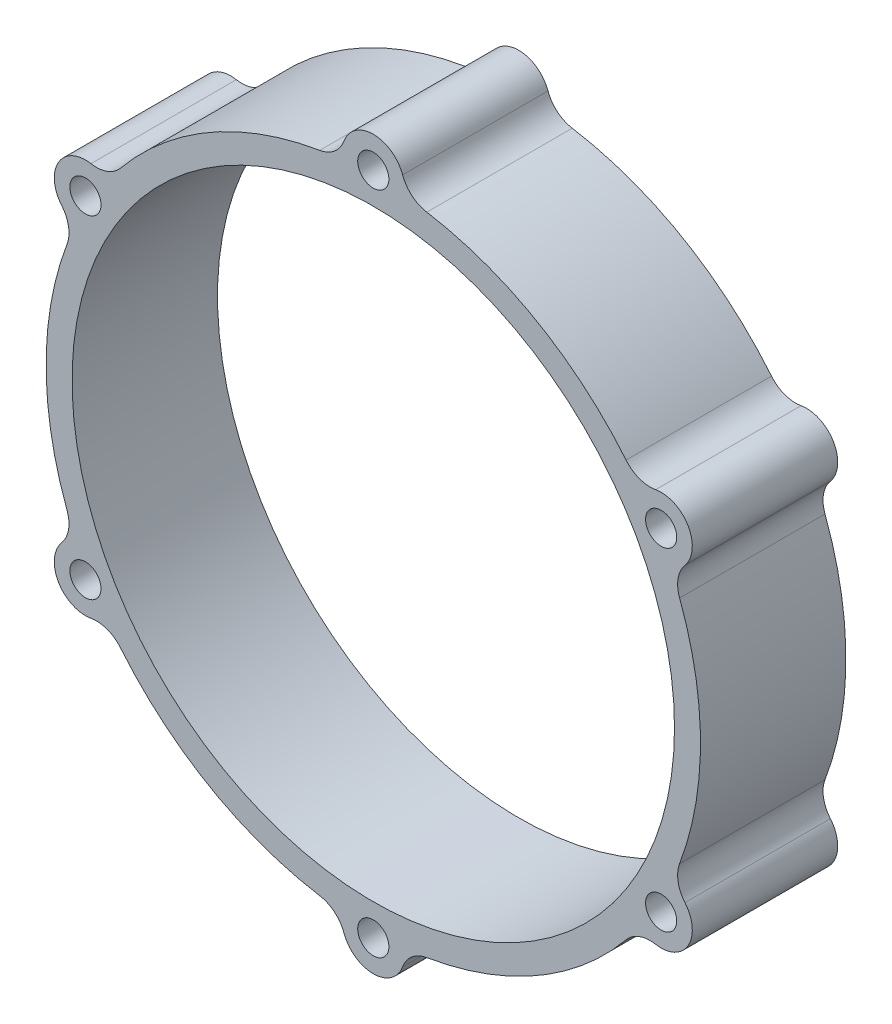
ISO-10303-21;
HEADER;
FILE_DESCRIPTION(('STEP AP214'),'2;1');
FILE_NAME('part.step','',(''),(''),'','','');
FILE_SCHEMA(('AUTOMOTIVE_DESIGN { 1 0 10303 214 1 1 1 1 }'));
ENDSEC;
DATA;
#1=APPLICATION_CONTEXT('core data for automotive mechanical design processes');
#2=APPLICATION_PROTOCOL_DEFINITION('international standard','automotive_design',2000,#1);
#3=PRODUCT_CONTEXT('',#1,'mechanical');
#4=PRODUCT('Part','Part','',(#3));
#5=PRODUCT_RELATED_PRODUCT_CATEGORY('part','',(#4));
#6=PRODUCT_DEFINITION_FORMATION('','',#4);
#7=PRODUCT_DEFINITION_CONTEXT('part definition',#1,'design');
#8=PRODUCT_DEFINITION('design','',#6,#7);
#9=PRODUCT_DEFINITION_SHAPE('','',#8);
#10=(LENGTH_UNIT() NAMED_UNIT(*) SI_UNIT(.MILLI.,.METRE.));
#11=(NAMED_UNIT(*) PLANE_ANGLE_UNIT() SI_UNIT($,.RADIAN.));
#12=(NAMED_UNIT(*) SI_UNIT($,.STERADIAN.) SOLID_ANGLE_UNIT());
#13=UNCERTAINTY_MEASURE_WITH_UNIT(LENGTH_MEASURE(1.E-05),#10,'distance_accuracy_value','');
#14=(GEOMETRIC_REPRESENTATION_CONTEXT(3) GLOBAL_UNCERTAINTY_ASSIGNED_CONTEXT((#13)) GLOBAL_UNIT_ASSIGNED_CONTEXT((#10,
#11,#12)) REPRESENTATION_CONTEXT('',''));
#15=CARTESIAN_POINT('',(0.,0.,0.));
#16=DIRECTION('',(0.,0.,1.));
#17=DIRECTION('',(1.,0.,0.));
#18=AXIS2_PLACEMENT_3D('',#15,#16,#17);
#19=CARTESIAN_POINT('',(0.,0.,14.));
#20=DIRECTION('',(0.,0.,-1.));
#21=DIRECTION('',(-1.,0.,0.));
#22=AXIS2_PLACEMENT_3D('',#19,#20,#21);
#23=CYLINDRICAL_SURFACE('',#22,31.5);
#24=CARTESIAN_POINT('',(0.,0.,14.));
#25=DIRECTION('',(0.,0.,1.));
#26=DIRECTION('',(1.,0.,0.));
#27=AXIS2_PLACEMENT_3D('',#24,#25,#26);
#28=CIRCLE('',#27,31.5);
#29=CARTESIAN_POINT('',(-29.4889858265997,11.0747331759552,14.));
#30=VERTEX_POINT('',#29);
#31=CARTESIAN_POINT('',(-29.4889858265997,-11.0747331759552,14.));
#32=VERTEX_POINT('',#31);
#33=EDGE_CURVE('E220',#30,#32,#28,.T.);
#34=ORIENTED_EDGE('',*,*,#33,.F.);
#35=DIRECTION('',(0.,0.,-1.));
#36=VECTOR('',#35,1.);
#37=CARTESIAN_POINT('',(-29.4889858265997,11.0747331759552,14.));
#38=LINE('',#37,#36);
#39=CARTESIAN_POINT('',(-29.4889858265997,11.0747331759552,0.));
#40=VERTEX_POINT('',#39);
#41=EDGE_CURVE('E237',#30,#40,#38,.T.);
#42=ORIENTED_EDGE('',*,*,#41,.T.);
#43=CARTESIAN_POINT('',(0.,0.,0.));
#44=DIRECTION('',(0.,0.,1.));
#45=DIRECTION('',(1.,0.,0.));
#46=AXIS2_PLACEMENT_3D('',#43,#44,#45);
#47=CIRCLE('',#46,31.5);
#48=CARTESIAN_POINT('',(-29.4889858265997,-11.0747331759552,0.));
#49=VERTEX_POINT('',#48);
#50=EDGE_CURVE('E218',#40,#49,#47,.T.);
#51=ORIENTED_EDGE('',*,*,#50,.T.);
#52=DIRECTION('',(0.,0.,-1.));
#53=VECTOR('',#52,1.);
#54=CARTESIAN_POINT('',(-29.4889858265997,-11.0747331759552,14.));
#55=LINE('',#54,#53);
#56=EDGE_CURVE('E234',#49,#32,#55,.F.);
#57=ORIENTED_EDGE('',*,*,#56,.T.);
#58=EDGE_LOOP('',(#34,#42,#51,#57));
#59=FACE_BOUND('',#58,.T.);
#60=ADVANCED_FACE('F43',(#59),#23,.T.);
#61=CARTESIAN_POINT('',(-24.3354931838113,-20.000844269697,14.));
#62=VERTEX_POINT('',#61);
#63=CARTESIAN_POINT('',(-5.15349264278836,-31.0755774456522,14.));
#64=VERTEX_POINT('',#63);
#65=EDGE_CURVE('E226',#62,#64,#28,.T.);
#66=ORIENTED_EDGE('',*,*,#65,.F.);
#67=DIRECTION('',(0.,0.,-1.));
#68=VECTOR('',#67,1.);
#69=CARTESIAN_POINT('',(-24.3354931838113,-20.000844269697,14.));
#70=LINE('',#69,#68);
#71=CARTESIAN_POINT('',(-24.3354931838113,-20.000844269697,0.));
#72=VERTEX_POINT('',#71);
#73=EDGE_CURVE('E247',#62,#72,#70,.T.);
#74=ORIENTED_EDGE('',*,*,#73,.T.);
#75=CARTESIAN_POINT('',(-5.15349264278836,-31.0755774456522,0.));
#76=VERTEX_POINT('',#75);
#77=EDGE_CURVE('E390',#72,#76,#47,.T.);
#78=ORIENTED_EDGE('',*,*,#77,.T.);
#79=DIRECTION('',(0.,0.,-1.));
#80=VECTOR('',#79,1.);
#81=CARTESIAN_POINT('',(-5.15349264278836,-31.0755774456522,14.));
#82=LINE('',#81,#80);
#83=EDGE_CURVE('E244',#76,#64,#82,.F.);
#84=ORIENTED_EDGE('',*,*,#83,.T.);
#85=EDGE_LOOP('',(#66,#74,#78,#84));
#86=FACE_BOUND('',#85,.T.);
#87=ADVANCED_FACE('F378',(#86),#23,.T.);
#88=CARTESIAN_POINT('',(5.15349264278837,-31.0755774456522,14.));
#89=VERTEX_POINT('',#88);
#90=CARTESIAN_POINT('',(24.3354931838113,-20.000844269697,14.));
#91=VERTEX_POINT('',#90);
#92=EDGE_CURVE('E367',#89,#91,#28,.T.);
#93=ORIENTED_EDGE('',*,*,#92,.F.);
#94=DIRECTION('',(0.,0.,-1.));
#95=VECTOR('',#94,1.);
#96=CARTESIAN_POINT('',(5.15349264278838,-31.0755774456522,14.));
#97=LINE('',#96,#95);
#98=CARTESIAN_POINT('',(5.15349264278837,-31.0755774456522,0.));
#99=VERTEX_POINT('',#98);
#100=EDGE_CURVE('E257',#89,#99,#97,.T.);
#101=ORIENTED_EDGE('',*,*,#100,.T.);
#102=CARTESIAN_POINT('',(24.3354931838113,-20.000844269697,0.));
#103=VERTEX_POINT('',#102);
#104=EDGE_CURVE('E428',#99,#103,#47,.T.);
#105=ORIENTED_EDGE('',*,*,#104,.T.);
#106=DIRECTION('',(0.,0.,-1.));
#107=VECTOR('',#106,1.);
#108=CARTESIAN_POINT('',(24.3354931838113,-20.000844269697,14.));
#109=LINE('',#108,#107);
#110=EDGE_CURVE('E254',#103,#91,#109,.F.);
#111=ORIENTED_EDGE('',*,*,#110,.T.);
#112=EDGE_LOOP('',(#93,#101,#105,#111));
#113=FACE_BOUND('',#112,.T.);
#114=ADVANCED_FACE('F467',(#113),#23,.T.);
#115=CARTESIAN_POINT('',(29.4889858265997,-11.0747331759552,14.));
#116=VERTEX_POINT('',#115);
#117=CARTESIAN_POINT('',(29.4889858265997,11.0747331759552,14.));
#118=VERTEX_POINT('',#117);
#119=EDGE_CURVE('E365',#116,#118,#28,.T.);
#120=ORIENTED_EDGE('',*,*,#119,.F.);
#121=DIRECTION('',(0.,0.,-1.));
#122=VECTOR('',#121,1.);
#123=CARTESIAN_POINT('',(29.4889858265997,-11.0747331759552,14.));
#124=LINE('',#123,#122);
#125=CARTESIAN_POINT('',(29.4889858265997,-11.0747331759552,0.));
#126=VERTEX_POINT('',#125);
#127=EDGE_CURVE('E267',#116,#126,#124,.T.);
#128=ORIENTED_EDGE('',*,*,#127,.T.);
#129=CARTESIAN_POINT('',(29.4889858265997,11.0747331759552,0.));
#130=VERTEX_POINT('',#129);
#131=EDGE_CURVE('E342',#126,#130,#47,.T.);
#132=ORIENTED_EDGE('',*,*,#131,.T.);
#133=DIRECTION('',(0.,0.,-1.));
#134=VECTOR('',#133,1.);
#135=CARTESIAN_POINT('',(29.4889858265997,11.0747331759552,14.));
#136=LINE('',#135,#134);
#137=EDGE_CURVE('E264',#130,#118,#136,.F.);
#138=ORIENTED_EDGE('',*,*,#137,.T.);
#139=EDGE_LOOP('',(#120,#128,#132,#138));
#140=FACE_BOUND('',#139,.T.);
#141=ADVANCED_FACE('F426',(#140),#23,.T.);
#142=CARTESIAN_POINT('',(24.3354931838113,20.000844269697,14.));
#143=VERTEX_POINT('',#142);
#144=CARTESIAN_POINT('',(5.1534926427884,31.0755774456522,14.));
#145=VERTEX_POINT('',#144);
#146=EDGE_CURVE('E217',#143,#145,#28,.T.);
#147=ORIENTED_EDGE('',*,*,#146,.F.);
#148=DIRECTION('',(0.,0.,-1.));
#149=VECTOR('',#148,1.);
#150=CARTESIAN_POINT('',(24.3354931838113,20.000844269697,14.));
#151=LINE('',#150,#149);
#152=CARTESIAN_POINT('',(24.3354931838113,20.000844269697,0.));
#153=VERTEX_POINT('',#152);
#154=EDGE_CURVE('E277',#143,#153,#151,.T.);
#155=ORIENTED_EDGE('',*,*,#154,.T.);
#156=CARTESIAN_POINT('',(5.1534926427884,31.0755774456522,0.));
#157=VERTEX_POINT('',#156);
#158=EDGE_CURVE('E228',#153,#157,#47,.T.);
#159=ORIENTED_EDGE('',*,*,#158,.T.);
#160=DIRECTION('',(0.,0.,-1.));
#161=VECTOR('',#160,1.);
#162=CARTESIAN_POINT('',(5.1534926427884,31.0755774456522,14.));
#163=LINE('',#162,#161);
#164=EDGE_CURVE('E274',#157,#145,#163,.F.);
#165=ORIENTED_EDGE('',*,*,#164,.T.);
#166=EDGE_LOOP('',(#147,#155,#159,#165));
#167=FACE_BOUND('',#166,.T.);
#168=ADVANCED_FACE('F340',(#167),#23,.T.);
#169=CARTESIAN_POINT('',(0.,0.,14.));
#170=DIRECTION('',(0.,0.,1.));
#171=DIRECTION('',(1.,0.,0.));
#172=AXIS2_PLACEMENT_3D('',#169,#170,#171);
#173=PLANE('',#172);
#174=CARTESIAN_POINT('',(0.,32.,14.));
#175=DIRECTION('',(0.,0.,1.));
#176=DIRECTION('',(1.,0.,0.));
#177=AXIS2_PLACEMENT_3D('',#174,#175,#176);
#178=CIRCLE('',#177,1.5);
#179=CARTESIAN_POINT('',(1.50000000000003,32.,14.));
#180=VERTEX_POINT('',#179);
#181=EDGE_CURVE('E731',#180,#180,#178,.T.);
#182=ORIENTED_EDGE('',*,*,#181,.F.);
#183=EDGE_LOOP('',(#182));
#184=FACE_BOUND('',#183,.T.);
#185=CARTESIAN_POINT('',(27.712812921102,16.,14.));
#186=DIRECTION('',(0.,0.,1.));
#187=DIRECTION('',(1.,0.,0.));
#188=AXIS2_PLACEMENT_3D('',#185,#186,#187);
#189=CIRCLE('',#188,1.5);
#190=CARTESIAN_POINT('',(29.212812921102,16.,14.));
#191=VERTEX_POINT('',#190);
#192=EDGE_CURVE('E754',#191,#191,#189,.T.);
#193=ORIENTED_EDGE('',*,*,#192,.F.);
#194=EDGE_LOOP('',(#193));
#195=FACE_BOUND('',#194,.T.);
#196=CARTESIAN_POINT('',(27.712812921102,-16.,14.));
#197=DIRECTION('',(0.,0.,1.));
#198=DIRECTION('',(1.,0.,0.));
#199=AXIS2_PLACEMENT_3D('',#196,#197,#198);
#200=CIRCLE('',#199,1.5);
#201=CARTESIAN_POINT('',(29.212812921102,-16.,14.));
#202=VERTEX_POINT('',#201);
#203=EDGE_CURVE('E748',#202,#202,#200,.T.);
#204=ORIENTED_EDGE('',*,*,#203,.F.);
#205=EDGE_LOOP('',(#204));
#206=FACE_BOUND('',#205,.T.);
#207=CARTESIAN_POINT('',(0.,-32.,14.));
#208=DIRECTION('',(0.,0.,1.));
#209=DIRECTION('',(1.,0.,0.));
#210=AXIS2_PLACEMENT_3D('',#207,#208,#209);
#211=CIRCLE('',#210,1.5);
#212=CARTESIAN_POINT('',(1.5,-32.,14.));
#213=VERTEX_POINT('',#212);
#214=EDGE_CURVE('E743',#213,#213,#211,.T.);
#215=ORIENTED_EDGE('',*,*,#214,.F.);
#216=EDGE_LOOP('',(#215));
#217=FACE_BOUND('',#216,.T.);
#218=CARTESIAN_POINT('',(-27.712812921102,-16.,14.));
#219=DIRECTION('',(0.,0.,1.));
#220=DIRECTION('',(1.,0.,0.));
#221=AXIS2_PLACEMENT_3D('',#218,#219,#220);
#222=CIRCLE('',#221,1.5);
#223=CARTESIAN_POINT('',(-26.212812921102,-16.,14.));
#224=VERTEX_POINT('',#223);
#225=EDGE_CURVE('E734',#224,#224,#222,.T.);
#226=ORIENTED_EDGE('',*,*,#225,.F.);
#227=EDGE_LOOP('',(#226));
#228=FACE_BOUND('',#227,.T.);
#229=CARTESIAN_POINT('',(-27.712812921102,16.,14.));
#230=DIRECTION('',(0.,0.,1.));
#231=DIRECTION('',(1.,0.,0.));
#232=AXIS2_PLACEMENT_3D('',#229,#230,#231);
#233=CIRCLE('',#232,1.5);
#234=CARTESIAN_POINT('',(-26.212812921102,16.,14.));
#235=VERTEX_POINT('',#234);
#236=EDGE_CURVE('E727',#235,#235,#233,.T.);
#237=ORIENTED_EDGE('',*,*,#236,.F.);
#238=EDGE_LOOP('',(#237));
#239=FACE_BOUND('',#238,.T.);
#240=CARTESIAN_POINT('',(-27.712812921102,16.,14.));
#241=DIRECTION('',(0.,0.,1.));
#242=DIRECTION('',(1.,0.,0.));
#243=AXIS2_PLACEMENT_3D('',#240,#241,#242);
#244=CIRCLE('',#243,3.);
#245=CARTESIAN_POINT('',(-27.1829860612096,18.9528432905484,14.));
#246=VERTEX_POINT('',#245);
#247=CARTESIAN_POINT('',(-30.0051367941651,14.0647348344516,14.));
#248=VERTEX_POINT('',#247);
#249=EDGE_CURVE('E349',#246,#248,#244,.T.);
#250=ORIENTED_EDGE('',*,*,#249,.T.);
#251=CARTESIAN_POINT('',(-32.2974606672283,12.1294696689033,14.));
#252=DIRECTION('',(0.,0.,1.));
#253=DIRECTION('',(1.,0.,0.));
#254=AXIS2_PLACEMENT_3D('',#251,#252,#253);
#255=CIRCLE('',#254,3.);
#256=EDGE_CURVE('E287',#248,#30,#255,.F.);
#257=ORIENTED_EDGE('',*,*,#256,.T.);
#258=ORIENTED_EDGE('',*,*,#33,.T.);
#259=CARTESIAN_POINT('',(-32.2974606672283,-12.1294696689033,14.));
#260=DIRECTION('',(0.,0.,1.));
#261=DIRECTION('',(1.,0.,0.));
#262=AXIS2_PLACEMENT_3D('',#259,#260,#261);
#263=CIRCLE('',#262,3.);
#264=CARTESIAN_POINT('',(-30.0051367941651,-14.0647348344516,14.));
#265=VERTEX_POINT('',#264);
#266=EDGE_CURVE('E291',#32,#265,#263,.F.);
#267=ORIENTED_EDGE('',*,*,#266,.T.);
#268=CARTESIAN_POINT('',(-27.712812921102,-16.,14.));
#269=DIRECTION('',(0.,0.,1.));
#270=DIRECTION('',(1.,0.,0.));
#271=AXIS2_PLACEMENT_3D('',#268,#269,#270);
#272=CIRCLE('',#271,3.);
#273=CARTESIAN_POINT('',(-27.1829860612096,-18.9528432905484,14.));
#274=VERTEX_POINT('',#273);
#275=EDGE_CURVE('E396',#265,#274,#272,.T.);
#276=ORIENTED_EDGE('',*,*,#275,.T.);
#277=CARTESIAN_POINT('',(-26.6531592013172,-21.9056865810967,14.));
#278=DIRECTION('',(0.,0.,1.));
#279=DIRECTION('',(1.,0.,0.));
#280=AXIS2_PLACEMENT_3D('',#277,#278,#279);
#281=CIRCLE('',#280,3.);
#282=EDGE_CURVE('E295',#274,#62,#281,.F.);
#283=ORIENTED_EDGE('',*,*,#282,.T.);
#284=ORIENTED_EDGE('',*,*,#65,.T.);
#285=CARTESIAN_POINT('',(-5.64430146591106,-34.03515625,14.));
#286=DIRECTION('',(0.,0.,1.));
#287=DIRECTION('',(1.,0.,0.));
#288=AXIS2_PLACEMENT_3D('',#285,#286,#287);
#289=CIRCLE('',#288,3.);
#290=CARTESIAN_POINT('',(-2.82215073295554,-33.017578125,14.));
#291=VERTEX_POINT('',#290);
#292=EDGE_CURVE('E299',#64,#291,#289,.F.);
#293=ORIENTED_EDGE('',*,*,#292,.T.);
#294=CARTESIAN_POINT('',(0.,-32.,14.));
#295=DIRECTION('',(0.,0.,1.));
#296=DIRECTION('',(1.,0.,0.));
#297=AXIS2_PLACEMENT_3D('',#294,#295,#296);
#298=CIRCLE('',#297,3.);
#299=CARTESIAN_POINT('',(2.82215073295554,-33.017578125,14.));
#300=VERTEX_POINT('',#299);
#301=EDGE_CURVE('E395',#291,#300,#298,.T.);
#302=ORIENTED_EDGE('',*,*,#301,.T.);
#303=CARTESIAN_POINT('',(5.64430146591108,-34.03515625,14.));
#304=DIRECTION('',(0.,0.,1.));
#305=DIRECTION('',(1.,0.,0.));
#306=AXIS2_PLACEMENT_3D('',#303,#304,#305);
#307=CIRCLE('',#306,3.);
#308=EDGE_CURVE('E303',#300,#89,#307,.F.);
#309=ORIENTED_EDGE('',*,*,#308,.T.);
#310=ORIENTED_EDGE('',*,*,#92,.T.);
#311=CARTESIAN_POINT('',(26.6531592013172,-21.9056865810967,14.));
#312=DIRECTION('',(0.,0.,1.));
#313=DIRECTION('',(1.,0.,0.));
#314=AXIS2_PLACEMENT_3D('',#311,#312,#313);
#315=CIRCLE('',#314,3.);
#316=CARTESIAN_POINT('',(27.1829860612096,-18.9528432905484,14.));
#317=VERTEX_POINT('',#316);
#318=EDGE_CURVE('E307',#91,#317,#315,.F.);
#319=ORIENTED_EDGE('',*,*,#318,.T.);
#320=CARTESIAN_POINT('',(27.712812921102,-16.,14.));
#321=DIRECTION('',(0.,0.,1.));
#322=DIRECTION('',(1.,0.,0.));
#323=AXIS2_PLACEMENT_3D('',#320,#321,#322);
#324=CIRCLE('',#323,3.);
#325=CARTESIAN_POINT('',(30.0051367941651,-14.0647348344516,14.));
#326=VERTEX_POINT('',#325);
#327=EDGE_CURVE('E406',#317,#326,#324,.T.);
#328=ORIENTED_EDGE('',*,*,#327,.T.);
#329=CARTESIAN_POINT('',(32.2974606672283,-12.1294696689033,14.));
#330=DIRECTION('',(0.,0.,1.));
#331=DIRECTION('',(1.,0.,0.));
#332=AXIS2_PLACEMENT_3D('',#329,#330,#331);
#333=CIRCLE('',#332,3.);
#334=EDGE_CURVE('E311',#326,#116,#333,.F.);
#335=ORIENTED_EDGE('',*,*,#334,.T.);
#336=ORIENTED_EDGE('',*,*,#119,.T.);
#337=CARTESIAN_POINT('',(32.2974606672282,12.1294696689033,14.));
#338=DIRECTION('',(0.,0.,1.));
#339=DIRECTION('',(1.,0.,0.));
#340=AXIS2_PLACEMENT_3D('',#337,#338,#339);
#341=CIRCLE('',#340,3.);
#342=CARTESIAN_POINT('',(30.0051367941651,14.0647348344516,14.));
#343=VERTEX_POINT('',#342);
#344=EDGE_CURVE('E315',#118,#343,#341,.F.);
#345=ORIENTED_EDGE('',*,*,#344,.T.);
#346=CARTESIAN_POINT('',(27.712812921102,16.,14.));
#347=DIRECTION('',(0.,0.,1.));
#348=DIRECTION('',(1.,0.,0.));
#349=AXIS2_PLACEMENT_3D('',#346,#347,#348);
#350=CIRCLE('',#349,3.);
#351=CARTESIAN_POINT('',(27.1829860612096,18.9528432905484,14.));
#352=VERTEX_POINT('',#351);
#353=EDGE_CURVE('E352',#343,#352,#350,.T.);
#354=ORIENTED_EDGE('',*,*,#353,.T.);
#355=CARTESIAN_POINT('',(26.6531592013172,21.9056865810967,14.));
#356=DIRECTION('',(0.,0.,1.));
#357=DIRECTION('',(1.,0.,0.));
#358=AXIS2_PLACEMENT_3D('',#355,#356,#357);
#359=CIRCLE('',#358,3.);
#360=EDGE_CURVE('E319',#352,#143,#359,.F.);
#361=ORIENTED_EDGE('',*,*,#360,.T.);
#362=ORIENTED_EDGE('',*,*,#146,.T.);
#363=CARTESIAN_POINT('',(5.6443014659111,34.03515625,14.));
#364=DIRECTION('',(0.,0.,1.));
#365=DIRECTION('',(1.,0.,0.));
#366=AXIS2_PLACEMENT_3D('',#363,#364,#365);
#367=CIRCLE('',#366,3.);
#368=CARTESIAN_POINT('',(2.82215073295557,33.017578125,14.));
#369=VERTEX_POINT('',#368);
#370=EDGE_CURVE('E65',#145,#369,#367,.F.);
#371=ORIENTED_EDGE('',*,*,#370,.T.);
#372=CARTESIAN_POINT('',(0.,32.,14.));
#373=DIRECTION('',(0.,0.,1.));
#374=DIRECTION('',(1.,0.,0.));
#375=AXIS2_PLACEMENT_3D('',#372,#373,#374);
#376=CIRCLE('',#375,3.);
#377=CARTESIAN_POINT('',(-2.82215073295551,33.017578125,14.));
#378=VERTEX_POINT('',#377);
#379=EDGE_CURVE('E207',#369,#378,#376,.T.);
#380=ORIENTED_EDGE('',*,*,#379,.T.);
#381=CARTESIAN_POINT('',(-5.64430146591104,34.03515625,14.));
#382=DIRECTION('',(0.,0.,1.));
#383=DIRECTION('',(1.,0.,0.));
#384=AXIS2_PLACEMENT_3D('',#381,#382,#383);
#385=CIRCLE('',#384,3.);
#386=CARTESIAN_POINT('',(-5.15349264278834,31.0755774456522,14.));
#387=VERTEX_POINT('',#386);
#388=EDGE_CURVE('E51',#378,#387,#385,.F.);
#389=ORIENTED_EDGE('',*,*,#388,.T.);
#390=CARTESIAN_POINT('',(-24.3354931838113,20.000844269697,14.));
#391=VERTEX_POINT('',#390);
#392=EDGE_CURVE('E206',#387,#391,#28,.T.);
#393=ORIENTED_EDGE('',*,*,#392,.T.);
#394=CARTESIAN_POINT('',(-26.6531592013172,21.9056865810967,14.));
#395=DIRECTION('',(0.,0.,1.));
#396=DIRECTION('',(1.,0.,0.));
#397=AXIS2_PLACEMENT_3D('',#394,#395,#396);
#398=CIRCLE('',#397,3.);
#399=EDGE_CURVE('E283',#391,#246,#398,.F.);
#400=ORIENTED_EDGE('',*,*,#399,.T.);
#401=EDGE_LOOP('',(#250,#257,#258,#267,#276,#283,#284,#293,#302,#309,#310,#319,#328,#335,#336,
#345,#354,#361,#362,#371,#380,#389,#393,#400));
#402=FACE_BOUND('',#401,.T.);
#403=CARTESIAN_POINT('',(0.,0.,14.));
#404=DIRECTION('',(0.,0.,1.));
#405=DIRECTION('',(1.,0.,0.));
#406=AXIS2_PLACEMENT_3D('',#403,#404,#405);
#407=CIRCLE('',#406,29.);
#408=CARTESIAN_POINT('',(29.,0.,14.));
#409=VERTEX_POINT('',#408);
#410=EDGE_CURVE('E361',#409,#409,#407,.T.);
#411=ORIENTED_EDGE('',*,*,#410,.F.);
#412=EDGE_LOOP('',(#411));
#413=FACE_BOUND('',#412,.T.);
#414=ADVANCED_FACE('F204',(#184,#195,#206,#217,#228,#239,#402,#413),#173,.T.);
#415=CARTESIAN_POINT('',(0.,0.,0.));
#416=DIRECTION('',(0.,0.,1.));
#417=DIRECTION('',(1.,0.,0.));
#418=AXIS2_PLACEMENT_3D('',#415,#416,#417);
#419=PLANE('',#418);
#420=CARTESIAN_POINT('',(0.,32.,0.));
#421=DIRECTION('',(0.,0.,1.));
#422=DIRECTION('',(1.,0.,0.));
#423=AXIS2_PLACEMENT_3D('',#420,#421,#422);
#424=CIRCLE('',#423,1.5);
#425=CARTESIAN_POINT('',(1.50000000000003,32.,0.));
#426=VERTEX_POINT('',#425);
#427=EDGE_CURVE('E400',#426,#426,#424,.T.);
#428=ORIENTED_EDGE('',*,*,#427,.T.);
#429=EDGE_LOOP('',(#428));
#430=FACE_BOUND('',#429,.T.);
#431=CARTESIAN_POINT('',(27.712812921102,16.,0.));
#432=DIRECTION('',(0.,0.,1.));
#433=DIRECTION('',(1.,0.,0.));
#434=AXIS2_PLACEMENT_3D('',#431,#432,#433);
#435=CIRCLE('',#434,1.5);
#436=CARTESIAN_POINT('',(29.212812921102,16.,0.));
#437=VERTEX_POINT('',#436);
#438=EDGE_CURVE('E750',#437,#437,#435,.T.);
#439=ORIENTED_EDGE('',*,*,#438,.T.);
#440=EDGE_LOOP('',(#439));
#441=FACE_BOUND('',#440,.T.);
#442=CARTESIAN_POINT('',(27.712812921102,-16.,0.));
#443=DIRECTION('',(0.,0.,1.));
#444=DIRECTION('',(1.,0.,0.));
#445=AXIS2_PLACEMENT_3D('',#442,#443,#444);
#446=CIRCLE('',#445,1.5);
#447=CARTESIAN_POINT('',(29.212812921102,-16.,0.));
#448=VERTEX_POINT('',#447);
#449=EDGE_CURVE('E746',#448,#448,#446,.T.);
#450=ORIENTED_EDGE('',*,*,#449,.T.);
#451=EDGE_LOOP('',(#450));
#452=FACE_BOUND('',#451,.T.);
#453=CARTESIAN_POINT('',(0.,-32.,0.));
#454=DIRECTION('',(0.,0.,1.));
#455=DIRECTION('',(1.,0.,0.));
#456=AXIS2_PLACEMENT_3D('',#453,#454,#455);
#457=CIRCLE('',#456,1.5);
#458=CARTESIAN_POINT('',(1.5,-32.,0.));
#459=VERTEX_POINT('',#458);
#460=EDGE_CURVE('E740',#459,#459,#457,.T.);
#461=ORIENTED_EDGE('',*,*,#460,.T.);
#462=EDGE_LOOP('',(#461));
#463=FACE_BOUND('',#462,.T.);
#464=CARTESIAN_POINT('',(-27.712812921102,-16.,0.));
#465=DIRECTION('',(0.,0.,1.));
#466=DIRECTION('',(1.,0.,0.));
#467=AXIS2_PLACEMENT_3D('',#464,#465,#466);
#468=CIRCLE('',#467,1.5);
#469=CARTESIAN_POINT('',(-26.212812921102,-16.,0.));
#470=VERTEX_POINT('',#469);
#471=EDGE_CURVE('E729',#470,#470,#468,.T.);
#472=ORIENTED_EDGE('',*,*,#471,.T.);
#473=EDGE_LOOP('',(#472));
#474=FACE_BOUND('',#473,.T.);
#475=CARTESIAN_POINT('',(-27.712812921102,16.,0.));
#476=DIRECTION('',(0.,0.,1.));
#477=DIRECTION('',(1.,0.,0.));
#478=AXIS2_PLACEMENT_3D('',#475,#476,#477);
#479=CIRCLE('',#478,1.5);
#480=CARTESIAN_POINT('',(-26.212812921102,16.,0.));
#481=VERTEX_POINT('',#480);
#482=EDGE_CURVE('E724',#481,#481,#479,.T.);
#483=ORIENTED_EDGE('',*,*,#482,.T.);
#484=EDGE_LOOP('',(#483));
#485=FACE_BOUND('',#484,.T.);
#486=ORIENTED_EDGE('',*,*,#50,.F.);
#487=CARTESIAN_POINT('',(-32.2974606672283,12.1294696689033,0.));
#488=DIRECTION('',(0.,0.,1.));
#489=DIRECTION('',(1.,0.,0.));
#490=AXIS2_PLACEMENT_3D('',#487,#488,#489);
#491=CIRCLE('',#490,3.);
#492=CARTESIAN_POINT('',(-30.0051367941651,14.0647348344516,0.));
#493=VERTEX_POINT('',#492);
#494=EDGE_CURVE('E289',#40,#493,#491,.T.);
#495=ORIENTED_EDGE('',*,*,#494,.T.);
#496=CARTESIAN_POINT('',(-27.712812921102,16.,0.));
#497=DIRECTION('',(0.,0.,1.));
#498=DIRECTION('',(1.,0.,0.));
#499=AXIS2_PLACEMENT_3D('',#496,#497,#498);
#500=CIRCLE('',#499,3.);
#501=CARTESIAN_POINT('',(-27.1829860612096,18.9528432905484,0.));
#502=VERTEX_POINT('',#501);
#503=EDGE_CURVE('E357',#493,#502,#500,.F.);
#504=ORIENTED_EDGE('',*,*,#503,.T.);
#505=CARTESIAN_POINT('',(-26.6531592013172,21.9056865810967,0.));
#506=DIRECTION('',(0.,0.,1.));
#507=DIRECTION('',(1.,0.,0.));
#508=AXIS2_PLACEMENT_3D('',#505,#506,#507);
#509=CIRCLE('',#508,3.);
#510=CARTESIAN_POINT('',(-24.3354931838113,20.000844269697,0.));
#511=VERTEX_POINT('',#510);
#512=EDGE_CURVE('E285',#502,#511,#509,.T.);
#513=ORIENTED_EDGE('',*,*,#512,.T.);
#514=CARTESIAN_POINT('',(-5.15349264278834,31.0755774456522,0.));
#515=VERTEX_POINT('',#514);
#516=EDGE_CURVE('E343',#515,#511,#47,.T.);
#517=ORIENTED_EDGE('',*,*,#516,.F.);
#518=CARTESIAN_POINT('',(-5.64430146591104,34.03515625,0.));
#519=DIRECTION('',(0.,0.,1.));
#520=DIRECTION('',(1.,0.,0.));
#521=AXIS2_PLACEMENT_3D('',#518,#519,#520);
#522=CIRCLE('',#521,3.);
#523=CARTESIAN_POINT('',(-2.82215073295551,33.017578125,0.));
#524=VERTEX_POINT('',#523);
#525=EDGE_CURVE('E11',#515,#524,#522,.T.);
#526=ORIENTED_EDGE('',*,*,#525,.T.);
#527=CARTESIAN_POINT('',(0.,32.,0.));
#528=DIRECTION('',(0.,0.,1.));
#529=DIRECTION('',(1.,0.,0.));
#530=AXIS2_PLACEMENT_3D('',#527,#528,#529);
#531=CIRCLE('',#530,3.);
#532=CARTESIAN_POINT('',(2.82215073295557,33.017578125,0.));
#533=VERTEX_POINT('',#532);
#534=EDGE_CURVE('E334',#524,#533,#531,.F.);
#535=ORIENTED_EDGE('',*,*,#534,.T.);
#536=CARTESIAN_POINT('',(5.6443014659111,34.03515625,0.));
#537=DIRECTION('',(0.,0.,1.));
#538=DIRECTION('',(1.,0.,0.));
#539=AXIS2_PLACEMENT_3D('',#536,#537,#538);
#540=CIRCLE('',#539,3.);
#541=EDGE_CURVE('E208',#533,#157,#540,.T.);
#542=ORIENTED_EDGE('',*,*,#541,.T.);
#543=ORIENTED_EDGE('',*,*,#158,.F.);
#544=CARTESIAN_POINT('',(26.6531592013172,21.9056865810967,0.));
#545=DIRECTION('',(0.,0.,1.));
#546=DIRECTION('',(1.,0.,0.));
#547=AXIS2_PLACEMENT_3D('',#544,#545,#546);
#548=CIRCLE('',#547,3.);
#549=CARTESIAN_POINT('',(27.1829860612096,18.9528432905484,0.));
#550=VERTEX_POINT('',#549);
#551=EDGE_CURVE('E321',#153,#550,#548,.T.);
#552=ORIENTED_EDGE('',*,*,#551,.T.);
#553=CARTESIAN_POINT('',(27.712812921102,16.,0.));
#554=DIRECTION('',(0.,0.,1.));
#555=DIRECTION('',(1.,0.,0.));
#556=AXIS2_PLACEMENT_3D('',#553,#554,#555);
#557=CIRCLE('',#556,3.);
#558=CARTESIAN_POINT('',(30.0051367941651,14.0647348344516,0.));
#559=VERTEX_POINT('',#558);
#560=EDGE_CURVE('E347',#550,#559,#557,.F.);
#561=ORIENTED_EDGE('',*,*,#560,.T.);
#562=CARTESIAN_POINT('',(32.2974606672282,12.1294696689033,0.));
#563=DIRECTION('',(0.,0.,1.));
#564=DIRECTION('',(1.,0.,0.));
#565=AXIS2_PLACEMENT_3D('',#562,#563,#564);
#566=CIRCLE('',#565,3.);
#567=EDGE_CURVE('E317',#559,#130,#566,.T.);
#568=ORIENTED_EDGE('',*,*,#567,.T.);
#569=ORIENTED_EDGE('',*,*,#131,.F.);
#570=CARTESIAN_POINT('',(32.2974606672283,-12.1294696689033,0.));
#571=DIRECTION('',(0.,0.,1.));
#572=DIRECTION('',(1.,0.,0.));
#573=AXIS2_PLACEMENT_3D('',#570,#571,#572);
#574=CIRCLE('',#573,3.);
#575=CARTESIAN_POINT('',(30.0051367941651,-14.0647348344516,0.));
#576=VERTEX_POINT('',#575);
#577=EDGE_CURVE('E313',#126,#576,#574,.T.);
#578=ORIENTED_EDGE('',*,*,#577,.T.);
#579=CARTESIAN_POINT('',(27.712812921102,-16.,0.));
#580=DIRECTION('',(0.,0.,1.));
#581=DIRECTION('',(1.,0.,0.));
#582=AXIS2_PLACEMENT_3D('',#579,#580,#581);
#583=CIRCLE('',#582,3.);
#584=CARTESIAN_POINT('',(27.1829860612096,-18.9528432905484,0.));
#585=VERTEX_POINT('',#584);
#586=EDGE_CURVE('E409',#576,#585,#583,.F.);
#587=ORIENTED_EDGE('',*,*,#586,.T.);
#588=CARTESIAN_POINT('',(26.6531592013172,-21.9056865810967,0.));
#589=DIRECTION('',(0.,0.,1.));
#590=DIRECTION('',(1.,0.,0.));
#591=AXIS2_PLACEMENT_3D('',#588,#589,#590);
#592=CIRCLE('',#591,3.);
#593=EDGE_CURVE('E309',#585,#103,#592,.T.);
#594=ORIENTED_EDGE('',*,*,#593,.T.);
#595=ORIENTED_EDGE('',*,*,#104,.F.);
#596=CARTESIAN_POINT('',(5.64430146591108,-34.03515625,0.));
#597=DIRECTION('',(0.,0.,1.));
#598=DIRECTION('',(1.,0.,0.));
#599=AXIS2_PLACEMENT_3D('',#596,#597,#598);
#600=CIRCLE('',#599,3.);
#601=CARTESIAN_POINT('',(2.82215073295554,-33.017578125,0.));
#602=VERTEX_POINT('',#601);
#603=EDGE_CURVE('E305',#99,#602,#600,.T.);
#604=ORIENTED_EDGE('',*,*,#603,.T.);
#605=CARTESIAN_POINT('',(0.,-32.,0.));
#606=DIRECTION('',(0.,0.,1.));
#607=DIRECTION('',(1.,0.,0.));
#608=AXIS2_PLACEMENT_3D('',#605,#606,#607);
#609=CIRCLE('',#608,3.);
#610=CARTESIAN_POINT('',(-2.82215073295554,-33.017578125,0.));
#611=VERTEX_POINT('',#610);
#612=EDGE_CURVE('E398',#602,#611,#609,.F.);
#613=ORIENTED_EDGE('',*,*,#612,.T.);
#614=CARTESIAN_POINT('',(-5.64430146591106,-34.03515625,0.));
#615=DIRECTION('',(0.,0.,1.));
#616=DIRECTION('',(1.,0.,0.));
#617=AXIS2_PLACEMENT_3D('',#614,#615,#616);
#618=CIRCLE('',#617,3.);
#619=EDGE_CURVE('E301',#611,#76,#618,.T.);
#620=ORIENTED_EDGE('',*,*,#619,.T.);
#621=ORIENTED_EDGE('',*,*,#77,.F.);
#622=CARTESIAN_POINT('',(-26.6531592013172,-21.9056865810967,0.));
#623=DIRECTION('',(0.,0.,1.));
#624=DIRECTION('',(1.,0.,0.));
#625=AXIS2_PLACEMENT_3D('',#622,#623,#624);
#626=CIRCLE('',#625,3.);
#627=CARTESIAN_POINT('',(-27.1829860612096,-18.9528432905484,0.));
#628=VERTEX_POINT('',#627);
#629=EDGE_CURVE('E297',#72,#628,#626,.T.);
#630=ORIENTED_EDGE('',*,*,#629,.T.);
#631=CARTESIAN_POINT('',(-27.712812921102,-16.,0.));
#632=DIRECTION('',(0.,0.,1.));
#633=DIRECTION('',(1.,0.,0.));
#634=AXIS2_PLACEMENT_3D('',#631,#632,#633);
#635=CIRCLE('',#634,3.);
#636=CARTESIAN_POINT('',(-30.0051367941651,-14.0647348344516,0.));
#637=VERTEX_POINT('',#636);
#638=EDGE_CURVE('E388',#628,#637,#635,.F.);
#639=ORIENTED_EDGE('',*,*,#638,.T.);
#640=CARTESIAN_POINT('',(-32.2974606672283,-12.1294696689033,0.));
#641=DIRECTION('',(0.,0.,1.));
#642=DIRECTION('',(1.,0.,0.));
#643=AXIS2_PLACEMENT_3D('',#640,#641,#642);
#644=CIRCLE('',#643,3.);
#645=EDGE_CURVE('E293',#637,#49,#644,.T.);
#646=ORIENTED_EDGE('',*,*,#645,.T.);
#647=EDGE_LOOP('',(#486,#495,#504,#513,#517,#526,#535,#542,#543,#552,#561,#568,#569,#578,#587,
#594,#595,#604,#613,#620,#621,#630,#639,#646));
#648=FACE_BOUND('',#647,.T.);
#649=CARTESIAN_POINT('',(0.,0.,0.));
#650=DIRECTION('',(0.,0.,1.));
#651=DIRECTION('',(1.,0.,0.));
#652=AXIS2_PLACEMENT_3D('',#649,#650,#651);
#653=CIRCLE('',#652,29.);
#654=CARTESIAN_POINT('',(29.,0.,0.));
#655=VERTEX_POINT('',#654);
#656=EDGE_CURVE('E360',#655,#655,#653,.T.);
#657=ORIENTED_EDGE('',*,*,#656,.T.);
#658=EDGE_LOOP('',(#657));
#659=FACE_BOUND('',#658,.T.);
#660=ADVANCED_FACE('F330',(#430,#441,#452,#463,#474,#485,#648,#659),#419,.F.);
#661=ORIENTED_EDGE('',*,*,#516,.T.);
#662=DIRECTION('',(0.,0.,-1.));
#663=VECTOR('',#662,1.);
#664=CARTESIAN_POINT('',(-24.3354931838113,20.000844269697,14.));
#665=LINE('',#664,#663);
#666=EDGE_CURVE('E216',#511,#391,#665,.F.);
#667=ORIENTED_EDGE('',*,*,#666,.T.);
#668=ORIENTED_EDGE('',*,*,#392,.F.);
#669=DIRECTION('',(0.,0.,-1.));
#670=VECTOR('',#669,1.);
#671=CARTESIAN_POINT('',(-5.15349264278835,31.0755774456522,14.));
#672=LINE('',#671,#670);
#673=EDGE_CURVE('E213',#387,#515,#672,.T.);
#674=ORIENTED_EDGE('',*,*,#673,.T.);
#675=EDGE_LOOP('',(#661,#667,#668,#674));
#676=FACE_BOUND('',#675,.T.);
#677=ADVANCED_FACE('F212',(#676),#23,.T.);
#678=CARTESIAN_POINT('',(0.,0.,14.));
#679=DIRECTION('',(0.,0.,-1.));
#680=DIRECTION('',(-1.,0.,0.));
#681=AXIS2_PLACEMENT_3D('',#678,#679,#680);
#682=CYLINDRICAL_SURFACE('',#681,29.);
#683=ORIENTED_EDGE('',*,*,#410,.T.);
#684=EDGE_LOOP('',(#683));
#685=FACE_BOUND('',#684,.T.);
#686=ORIENTED_EDGE('',*,*,#656,.F.);
#687=EDGE_LOOP('',(#686));
#688=FACE_BOUND('',#687,.T.);
#689=ADVANCED_FACE('F471',(#685,#688),#682,.F.);
#690=CARTESIAN_POINT('',(-27.712812921102,16.,-7.71232981951098));
#691=DIRECTION('',(0.,0.,1.));
#692=DIRECTION('',(1.,0.,0.));
#693=AXIS2_PLACEMENT_3D('',#690,#691,#692);
#694=CYLINDRICAL_SURFACE('',#693,3.);
#695=ORIENTED_EDGE('',*,*,#249,.F.);
#696=DIRECTION('',(0.,0.,1.));
#697=VECTOR('',#696,1.);
#698=CARTESIAN_POINT('',(-27.1829860612096,18.9528432905484,-7.71232981951098));
#699=LINE('',#698,#697);
#700=EDGE_CURVE('E232',#246,#502,#699,.F.);
#701=ORIENTED_EDGE('',*,*,#700,.T.);
#702=ORIENTED_EDGE('',*,*,#503,.F.);
#703=DIRECTION('',(0.,0.,1.));
#704=VECTOR('',#703,1.);
#705=CARTESIAN_POINT('',(-30.0051367941651,14.0647348344516,-7.71232981951098));
#706=LINE('',#705,#704);
#707=EDGE_CURVE('E223',#493,#248,#706,.T.);
#708=ORIENTED_EDGE('',*,*,#707,.T.);
#709=EDGE_LOOP('',(#695,#701,#702,#708));
#710=FACE_BOUND('',#709,.T.);
#711=ADVANCED_FACE('F442',(#710),#694,.T.);
#712=CARTESIAN_POINT('',(0.,32.,-7.71232981951098));
#713=DIRECTION('',(0.,0.,1.));
#714=DIRECTION('',(1.,0.,0.));
#715=AXIS2_PLACEMENT_3D('',#712,#713,#714);
#716=CYLINDRICAL_SURFACE('',#715,3.);
#717=ORIENTED_EDGE('',*,*,#379,.F.);
#718=DIRECTION('',(0.,0.,1.));
#719=VECTOR('',#718,1.);
#720=CARTESIAN_POINT('',(2.82215073295557,33.017578125,-7.71232981951098));
#721=LINE('',#720,#719);
#722=EDGE_CURVE('E281',#369,#533,#721,.F.);
#723=ORIENTED_EDGE('',*,*,#722,.T.);
#724=ORIENTED_EDGE('',*,*,#534,.F.);
#725=DIRECTION('',(0.,0.,1.));
#726=VECTOR('',#725,1.);
#727=CARTESIAN_POINT('',(-2.82215073295551,33.017578125,-7.71232981951098));
#728=LINE('',#727,#726);
#729=EDGE_CURVE('E279',#524,#378,#728,.T.);
#730=ORIENTED_EDGE('',*,*,#729,.T.);
#731=EDGE_LOOP('',(#717,#723,#724,#730));
#732=FACE_BOUND('',#731,.T.);
#733=ADVANCED_FACE('F346',(#732),#716,.T.);
#734=CARTESIAN_POINT('',(27.712812921102,16.,-7.71232981951098));
#735=DIRECTION('',(0.,0.,1.));
#736=DIRECTION('',(1.,0.,0.));
#737=AXIS2_PLACEMENT_3D('',#734,#735,#736);
#738=CYLINDRICAL_SURFACE('',#737,3.);
#739=ORIENTED_EDGE('',*,*,#353,.F.);
#740=DIRECTION('',(0.,0.,1.));
#741=VECTOR('',#740,1.);
#742=CARTESIAN_POINT('',(30.0051367941651,14.0647348344516,-7.71232981951098));
#743=LINE('',#742,#741);
#744=EDGE_CURVE('E272',#343,#559,#743,.F.);
#745=ORIENTED_EDGE('',*,*,#744,.T.);
#746=ORIENTED_EDGE('',*,*,#560,.F.);
#747=DIRECTION('',(0.,0.,1.));
#748=VECTOR('',#747,1.);
#749=CARTESIAN_POINT('',(27.1829860612096,18.9528432905484,-7.71232981951098));
#750=LINE('',#749,#748);
#751=EDGE_CURVE('E269',#550,#352,#750,.T.);
#752=ORIENTED_EDGE('',*,*,#751,.T.);
#753=EDGE_LOOP('',(#739,#745,#746,#752));
#754=FACE_BOUND('',#753,.T.);
#755=ADVANCED_FACE('F415',(#754),#738,.T.);
#756=CARTESIAN_POINT('',(27.712812921102,-16.,-7.71232981951098));
#757=DIRECTION('',(0.,0.,1.));
#758=DIRECTION('',(1.,0.,0.));
#759=AXIS2_PLACEMENT_3D('',#756,#757,#758);
#760=CYLINDRICAL_SURFACE('',#759,3.);
#761=ORIENTED_EDGE('',*,*,#327,.F.);
#762=DIRECTION('',(0.,0.,1.));
#763=VECTOR('',#762,1.);
#764=CARTESIAN_POINT('',(27.1829860612096,-18.9528432905484,-7.71232981951098));
#765=LINE('',#764,#763);
#766=EDGE_CURVE('E262',#317,#585,#765,.F.);
#767=ORIENTED_EDGE('',*,*,#766,.T.);
#768=ORIENTED_EDGE('',*,*,#586,.F.);
#769=DIRECTION('',(0.,0.,1.));
#770=VECTOR('',#769,1.);
#771=CARTESIAN_POINT('',(30.0051367941651,-14.0647348344516,-7.71232981951098));
#772=LINE('',#771,#770);
#773=EDGE_CURVE('E259',#576,#326,#772,.T.);
#774=ORIENTED_EDGE('',*,*,#773,.T.);
#775=EDGE_LOOP('',(#761,#767,#768,#774));
#776=FACE_BOUND('',#775,.T.);
#777=ADVANCED_FACE('F628',(#776),#760,.T.);
#778=CARTESIAN_POINT('',(0.,-32.,-7.71232981951098));
#779=DIRECTION('',(0.,0.,1.));
#780=DIRECTION('',(1.,0.,0.));
#781=AXIS2_PLACEMENT_3D('',#778,#779,#780);
#782=CYLINDRICAL_SURFACE('',#781,3.);
#783=ORIENTED_EDGE('',*,*,#301,.F.);
#784=DIRECTION('',(0.,0.,1.));
#785=VECTOR('',#784,1.);
#786=CARTESIAN_POINT('',(-2.82215073295554,-33.017578125,-7.71232981951098));
#787=LINE('',#786,#785);
#788=EDGE_CURVE('E252',#291,#611,#787,.F.);
#789=ORIENTED_EDGE('',*,*,#788,.T.);
#790=ORIENTED_EDGE('',*,*,#612,.F.);
#791=DIRECTION('',(0.,0.,1.));
#792=VECTOR('',#791,1.);
#793=CARTESIAN_POINT('',(2.82215073295554,-33.017578125,-7.71232981951098));
#794=LINE('',#793,#792);
#795=EDGE_CURVE('E249',#602,#300,#794,.T.);
#796=ORIENTED_EDGE('',*,*,#795,.T.);
#797=EDGE_LOOP('',(#783,#789,#790,#796));
#798=FACE_BOUND('',#797,.T.);
#799=ADVANCED_FACE('F500',(#798),#782,.T.);
#800=CARTESIAN_POINT('',(-27.712812921102,-16.,-7.71232981951098));
#801=DIRECTION('',(0.,0.,1.));
#802=DIRECTION('',(1.,0.,0.));
#803=AXIS2_PLACEMENT_3D('',#800,#801,#802);
#804=CYLINDRICAL_SURFACE('',#803,3.);
#805=ORIENTED_EDGE('',*,*,#275,.F.);
#806=DIRECTION('',(0.,0.,1.));
#807=VECTOR('',#806,1.);
#808=CARTESIAN_POINT('',(-30.0051367941651,-14.0647348344516,-7.71232981951098));
#809=LINE('',#808,#807);
#810=EDGE_CURVE('E242',#265,#637,#809,.F.);
#811=ORIENTED_EDGE('',*,*,#810,.T.);
#812=ORIENTED_EDGE('',*,*,#638,.F.);
#813=DIRECTION('',(0.,0.,1.));
#814=VECTOR('',#813,1.);
#815=CARTESIAN_POINT('',(-27.1829860612096,-18.9528432905484,-7.71232981951098));
#816=LINE('',#815,#814);
#817=EDGE_CURVE('E239',#628,#274,#816,.T.);
#818=ORIENTED_EDGE('',*,*,#817,.T.);
#819=EDGE_LOOP('',(#805,#811,#812,#818));
#820=FACE_BOUND('',#819,.T.);
#821=ADVANCED_FACE('F393',(#820),#804,.T.);
#822=CARTESIAN_POINT('',(-27.712812921102,16.,0.));
#823=DIRECTION('',(0.,0.,1.));
#824=DIRECTION('',(1.,0.,0.));
#825=AXIS2_PLACEMENT_3D('',#822,#823,#824);
#826=CYLINDRICAL_SURFACE('',#825,1.5);
#827=ORIENTED_EDGE('',*,*,#482,.F.);
#828=EDGE_LOOP('',(#827));
#829=FACE_BOUND('',#828,.T.);
#830=ORIENTED_EDGE('',*,*,#236,.T.);
#831=EDGE_LOOP('',(#830));
#832=FACE_BOUND('',#831,.T.);
#833=ADVANCED_FACE('F608',(#829,#832),#826,.F.);
#834=CARTESIAN_POINT('',(-27.712812921102,-16.,0.));
#835=DIRECTION('',(0.,0.,1.));
#836=DIRECTION('',(1.,0.,0.));
#837=AXIS2_PLACEMENT_3D('',#834,#835,#836);
#838=CYLINDRICAL_SURFACE('',#837,1.5);
#839=ORIENTED_EDGE('',*,*,#471,.F.);
#840=EDGE_LOOP('',(#839));
#841=FACE_BOUND('',#840,.T.);
#842=ORIENTED_EDGE('',*,*,#225,.T.);
#843=EDGE_LOOP('',(#842));
#844=FACE_BOUND('',#843,.T.);
#845=ADVANCED_FACE('F600',(#841,#844),#838,.F.);
#846=CARTESIAN_POINT('',(0.,-32.,0.));
#847=DIRECTION('',(0.,0.,1.));
#848=DIRECTION('',(1.,0.,0.));
#849=AXIS2_PLACEMENT_3D('',#846,#847,#848);
#850=CYLINDRICAL_SURFACE('',#849,1.5);
#851=ORIENTED_EDGE('',*,*,#460,.F.);
#852=EDGE_LOOP('',(#851));
#853=FACE_BOUND('',#852,.T.);
#854=ORIENTED_EDGE('',*,*,#214,.T.);
#855=EDGE_LOOP('',(#854));
#856=FACE_BOUND('',#855,.T.);
#857=ADVANCED_FACE('F592',(#853,#856),#850,.F.);
#858=CARTESIAN_POINT('',(27.712812921102,-16.,0.));
#859=DIRECTION('',(0.,0.,1.));
#860=DIRECTION('',(1.,0.,0.));
#861=AXIS2_PLACEMENT_3D('',#858,#859,#860);
#862=CYLINDRICAL_SURFACE('',#861,1.5);
#863=ORIENTED_EDGE('',*,*,#449,.F.);
#864=EDGE_LOOP('',(#863));
#865=FACE_BOUND('',#864,.T.);
#866=ORIENTED_EDGE('',*,*,#203,.T.);
#867=EDGE_LOOP('',(#866));
#868=FACE_BOUND('',#867,.T.);
#869=ADVANCED_FACE('F584',(#865,#868),#862,.F.);
#870=CARTESIAN_POINT('',(27.712812921102,16.,0.));
#871=DIRECTION('',(0.,0.,1.));
#872=DIRECTION('',(1.,0.,0.));
#873=AXIS2_PLACEMENT_3D('',#870,#871,#872);
#874=CYLINDRICAL_SURFACE('',#873,1.5);
#875=ORIENTED_EDGE('',*,*,#438,.F.);
#876=EDGE_LOOP('',(#875));
#877=FACE_BOUND('',#876,.T.);
#878=ORIENTED_EDGE('',*,*,#192,.T.);
#879=EDGE_LOOP('',(#878));
#880=FACE_BOUND('',#879,.T.);
#881=ADVANCED_FACE('F576',(#877,#880),#874,.F.);
#882=CARTESIAN_POINT('',(0.,32.,0.));
#883=DIRECTION('',(0.,0.,1.));
#884=DIRECTION('',(1.,0.,0.));
#885=AXIS2_PLACEMENT_3D('',#882,#883,#884);
#886=CYLINDRICAL_SURFACE('',#885,1.5);
#887=ORIENTED_EDGE('',*,*,#427,.F.);
#888=EDGE_LOOP('',(#887));
#889=FACE_BOUND('',#888,.T.);
#890=ORIENTED_EDGE('',*,*,#181,.T.);
#891=EDGE_LOOP('',(#890));
#892=FACE_BOUND('',#891,.T.);
#893=ADVANCED_FACE('F570',(#889,#892),#886,.F.);
#894=CARTESIAN_POINT('',(-26.6531592013172,21.9056865810967,-7.71232981951098));
#895=DIRECTION('',(0.,0.,-1.));
#896=DIRECTION('',(-1.,0.,0.));
#897=AXIS2_PLACEMENT_3D('',#894,#895,#896);
#898=CYLINDRICAL_SURFACE('',#897,3.);
#899=ORIENTED_EDGE('',*,*,#512,.F.);
#900=ORIENTED_EDGE('',*,*,#700,.F.);
#901=ORIENTED_EDGE('',*,*,#399,.F.);
#902=ORIENTED_EDGE('',*,*,#666,.F.);
#903=EDGE_LOOP('',(#899,#900,#901,#902));
#904=FACE_BOUND('',#903,.T.);
#905=ADVANCED_FACE('F438',(#904),#898,.F.);
#906=CARTESIAN_POINT('',(-32.2974606672283,12.1294696689033,14.));
#907=DIRECTION('',(0.,0.,-1.));
#908=DIRECTION('',(-1.,0.,0.));
#909=AXIS2_PLACEMENT_3D('',#906,#907,#908);
#910=CYLINDRICAL_SURFACE('',#909,3.);
#911=ORIENTED_EDGE('',*,*,#494,.F.);
#912=ORIENTED_EDGE('',*,*,#41,.F.);
#913=ORIENTED_EDGE('',*,*,#256,.F.);
#914=ORIENTED_EDGE('',*,*,#707,.F.);
#915=EDGE_LOOP('',(#911,#912,#913,#914));
#916=FACE_BOUND('',#915,.T.);
#917=ADVANCED_FACE('F447',(#916),#910,.F.);
#918=CARTESIAN_POINT('',(-32.2974606672283,-12.1294696689033,-7.71232981951098));
#919=DIRECTION('',(0.,0.,-1.));
#920=DIRECTION('',(-1.,0.,0.));
#921=AXIS2_PLACEMENT_3D('',#918,#919,#920);
#922=CYLINDRICAL_SURFACE('',#921,3.);
#923=ORIENTED_EDGE('',*,*,#645,.F.);
#924=ORIENTED_EDGE('',*,*,#810,.F.);
#925=ORIENTED_EDGE('',*,*,#266,.F.);
#926=ORIENTED_EDGE('',*,*,#56,.F.);
#927=EDGE_LOOP('',(#923,#924,#925,#926));
#928=FACE_BOUND('',#927,.T.);
#929=ADVANCED_FACE('F451',(#928),#922,.F.);
#930=CARTESIAN_POINT('',(-26.6531592013172,-21.9056865810967,14.));
#931=DIRECTION('',(0.,0.,-1.));
#932=DIRECTION('',(-1.,0.,0.));
#933=AXIS2_PLACEMENT_3D('',#930,#931,#932);
#934=CYLINDRICAL_SURFACE('',#933,3.);
#935=ORIENTED_EDGE('',*,*,#629,.F.);
#936=ORIENTED_EDGE('',*,*,#73,.F.);
#937=ORIENTED_EDGE('',*,*,#282,.F.);
#938=ORIENTED_EDGE('',*,*,#817,.F.);
#939=EDGE_LOOP('',(#935,#936,#937,#938));
#940=FACE_BOUND('',#939,.T.);
#941=ADVANCED_FACE('F384',(#940),#934,.F.);
#942=CARTESIAN_POINT('',(-5.64430146591106,-34.03515625,-7.71232981951098));
#943=DIRECTION('',(0.,0.,-1.));
#944=DIRECTION('',(-1.,0.,0.));
#945=AXIS2_PLACEMENT_3D('',#942,#943,#944);
#946=CYLINDRICAL_SURFACE('',#945,3.);
#947=ORIENTED_EDGE('',*,*,#619,.F.);
#948=ORIENTED_EDGE('',*,*,#788,.F.);
#949=ORIENTED_EDGE('',*,*,#292,.F.);
#950=ORIENTED_EDGE('',*,*,#83,.F.);
#951=EDGE_LOOP('',(#947,#948,#949,#950));
#952=FACE_BOUND('',#951,.T.);
#953=ADVANCED_FACE('F458',(#952),#946,.F.);
#954=CARTESIAN_POINT('',(5.64430146591108,-34.03515625,14.));
#955=DIRECTION('',(0.,0.,-1.));
#956=DIRECTION('',(-1.,0.,0.));
#957=AXIS2_PLACEMENT_3D('',#954,#955,#956);
#958=CYLINDRICAL_SURFACE('',#957,3.);
#959=ORIENTED_EDGE('',*,*,#603,.F.);
#960=ORIENTED_EDGE('',*,*,#100,.F.);
#961=ORIENTED_EDGE('',*,*,#308,.F.);
#962=ORIENTED_EDGE('',*,*,#795,.F.);
#963=EDGE_LOOP('',(#959,#960,#961,#962));
#964=FACE_BOUND('',#963,.T.);
#965=ADVANCED_FACE('F495',(#964),#958,.F.);
#966=CARTESIAN_POINT('',(26.6531592013172,-21.9056865810967,-7.71232981951098));
#967=DIRECTION('',(0.,0.,-1.));
#968=DIRECTION('',(-1.,0.,0.));
#969=AXIS2_PLACEMENT_3D('',#966,#967,#968);
#970=CYLINDRICAL_SURFACE('',#969,3.);
#971=ORIENTED_EDGE('',*,*,#593,.F.);
#972=ORIENTED_EDGE('',*,*,#766,.F.);
#973=ORIENTED_EDGE('',*,*,#318,.F.);
#974=ORIENTED_EDGE('',*,*,#110,.F.);
#975=EDGE_LOOP('',(#971,#972,#973,#974));
#976=FACE_BOUND('',#975,.T.);
#977=ADVANCED_FACE('F508',(#976),#970,.F.);
#978=CARTESIAN_POINT('',(32.2974606672283,-12.1294696689033,14.));
#979=DIRECTION('',(0.,0.,-1.));
#980=DIRECTION('',(-1.,0.,0.));
#981=AXIS2_PLACEMENT_3D('',#978,#979,#980);
#982=CYLINDRICAL_SURFACE('',#981,3.);
#983=ORIENTED_EDGE('',*,*,#577,.F.);
#984=ORIENTED_EDGE('',*,*,#127,.F.);
#985=ORIENTED_EDGE('',*,*,#334,.F.);
#986=ORIENTED_EDGE('',*,*,#773,.F.);
#987=EDGE_LOOP('',(#983,#984,#985,#986));
#988=FACE_BOUND('',#987,.T.);
#989=ADVANCED_FACE('F513',(#988),#982,.F.);
#990=CARTESIAN_POINT('',(32.2974606672282,12.1294696689033,-7.71232981951098));
#991=DIRECTION('',(0.,0.,-1.));
#992=DIRECTION('',(-1.,0.,0.));
#993=AXIS2_PLACEMENT_3D('',#990,#991,#992);
#994=CYLINDRICAL_SURFACE('',#993,3.);
#995=ORIENTED_EDGE('',*,*,#567,.F.);
#996=ORIENTED_EDGE('',*,*,#744,.F.);
#997=ORIENTED_EDGE('',*,*,#344,.F.);
#998=ORIENTED_EDGE('',*,*,#137,.F.);
#999=EDGE_LOOP('',(#995,#996,#997,#998));
#1000=FACE_BOUND('',#999,.T.);
#1001=ADVANCED_FACE('F420',(#1000),#994,.F.);
#1002=CARTESIAN_POINT('',(26.6531592013172,21.9056865810967,14.));
#1003=DIRECTION('',(0.,0.,-1.));
#1004=DIRECTION('',(-1.,0.,0.));
#1005=AXIS2_PLACEMENT_3D('',#1002,#1003,#1004);
#1006=CYLINDRICAL_SURFACE('',#1005,3.);
#1007=ORIENTED_EDGE('',*,*,#551,.F.);
#1008=ORIENTED_EDGE('',*,*,#154,.F.);
#1009=ORIENTED_EDGE('',*,*,#360,.F.);
#1010=ORIENTED_EDGE('',*,*,#751,.F.);
#1011=EDGE_LOOP('',(#1007,#1008,#1009,#1010));
#1012=FACE_BOUND('',#1011,.T.);
#1013=ADVANCED_FACE('F520',(#1012),#1006,.F.);
#1014=CARTESIAN_POINT('',(5.6443014659111,34.03515625,-7.71232981951098));
#1015=DIRECTION('',(0.,0.,-1.));
#1016=DIRECTION('',(-1.,0.,0.));
#1017=AXIS2_PLACEMENT_3D('',#1014,#1015,#1016);
#1018=CYLINDRICAL_SURFACE('',#1017,3.);
#1019=ORIENTED_EDGE('',*,*,#541,.F.);
#1020=ORIENTED_EDGE('',*,*,#722,.F.);
#1021=ORIENTED_EDGE('',*,*,#370,.F.);
#1022=ORIENTED_EDGE('',*,*,#164,.F.);
#1023=EDGE_LOOP('',(#1019,#1020,#1021,#1022));
#1024=FACE_BOUND('',#1023,.T.);
#1025=ADVANCED_FACE('F344',(#1024),#1018,.F.);
#1026=CARTESIAN_POINT('',(-5.64430146591104,34.03515625,14.));
#1027=DIRECTION('',(0.,0.,-1.));
#1028=DIRECTION('',(-1.,0.,0.));
#1029=AXIS2_PLACEMENT_3D('',#1026,#1027,#1028);
#1030=CYLINDRICAL_SURFACE('',#1029,3.);
#1031=ORIENTED_EDGE('',*,*,#525,.F.);
#1032=ORIENTED_EDGE('',*,*,#673,.F.);
#1033=ORIENTED_EDGE('',*,*,#388,.F.);
#1034=ORIENTED_EDGE('',*,*,#729,.F.);
#1035=EDGE_LOOP('',(#1031,#1032,#1033,#1034));
#1036=FACE_BOUND('',#1035,.T.);
#1037=ADVANCED_FACE('F45',(#1036),#1030,.F.);
#1038=CLOSED_SHELL('',(#60,#87,#114,#141,#168,#414,#660,#677,#689,#711,#733,#755,#777,#799,#821,
#833,#845,#857,#869,#881,#893,#905,#917,#929,#941,#953,#965,#977,#989,#1001,#1013,#1025,#1037));
#1039=MANIFOLD_SOLID_BREP('B2',#1038);
#1040=ADVANCED_BREP_SHAPE_REPRESENTATION('',(#18,#1039),#14);
#1041=SHAPE_DEFINITION_REPRESENTATION(#9,#1040);
ENDSEC;
END-ISO-10303-21;
